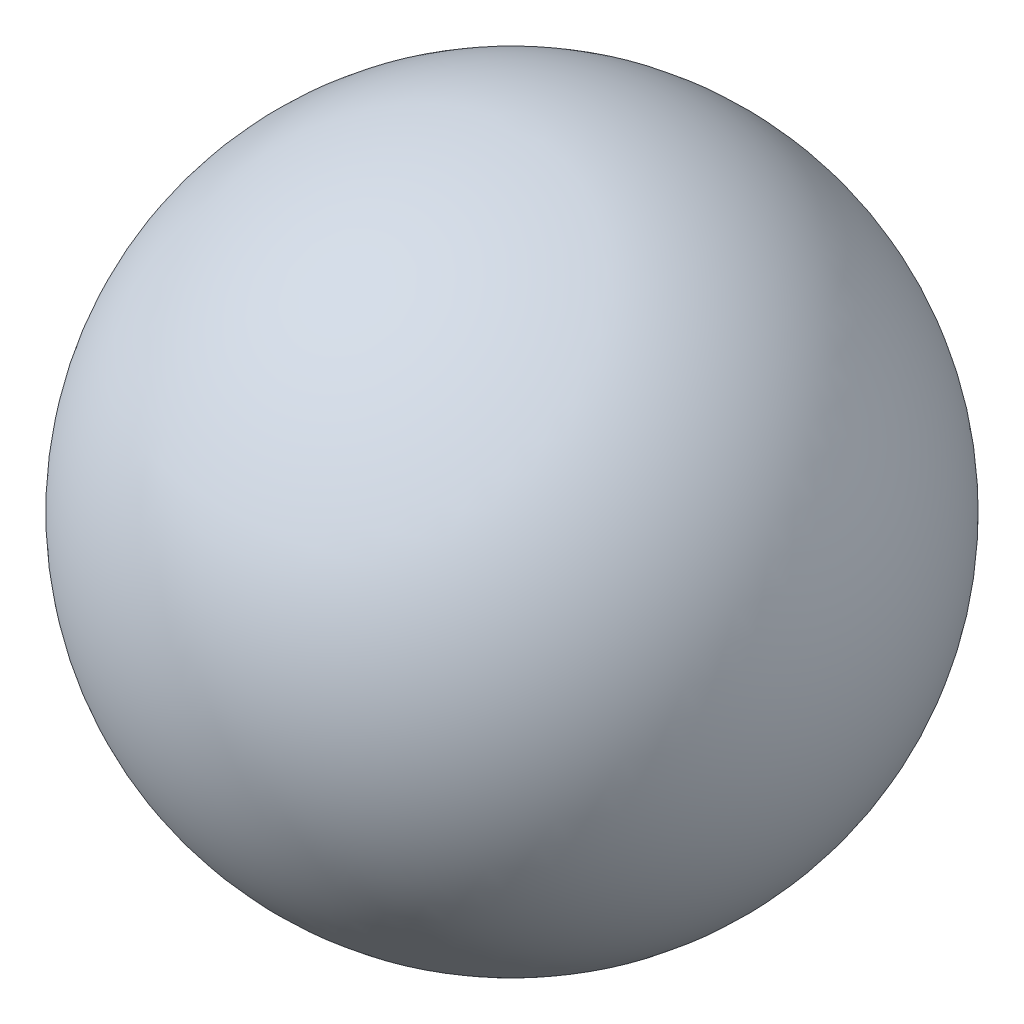
ISO-10303-21;
HEADER;
FILE_DESCRIPTION(('STEP AP214'),'2;1');
FILE_NAME('part.step','',(''),(''),'','','');
FILE_SCHEMA(('AUTOMOTIVE_DESIGN { 1 0 10303 214 1 1 1 1 }'));
ENDSEC;
DATA;
#1=APPLICATION_CONTEXT('core data for automotive mechanical design processes');
#2=APPLICATION_PROTOCOL_DEFINITION('international standard','automotive_design',2000,#1);
#3=PRODUCT_CONTEXT('',#1,'mechanical');
#4=PRODUCT('Part','Part','',(#3));
#5=PRODUCT_RELATED_PRODUCT_CATEGORY('part','',(#4));
#6=PRODUCT_DEFINITION_FORMATION('','',#4);
#7=PRODUCT_DEFINITION_CONTEXT('part definition',#1,'design');
#8=PRODUCT_DEFINITION('design','',#6,#7);
#9=PRODUCT_DEFINITION_SHAPE('','',#8);
#10=(LENGTH_UNIT() NAMED_UNIT(*) SI_UNIT(.MILLI.,.METRE.));
#11=(NAMED_UNIT(*) PLANE_ANGLE_UNIT() SI_UNIT($,.RADIAN.));
#12=(NAMED_UNIT(*) SI_UNIT($,.STERADIAN.) SOLID_ANGLE_UNIT());
#13=UNCERTAINTY_MEASURE_WITH_UNIT(LENGTH_MEASURE(1.E-05),#10,'distance_accuracy_value','');
#14=(GEOMETRIC_REPRESENTATION_CONTEXT(3) GLOBAL_UNCERTAINTY_ASSIGNED_CONTEXT((#13)) GLOBAL_UNIT_ASSIGNED_CONTEXT((#10,
#11,#12)) REPRESENTATION_CONTEXT('',''));
#15=CARTESIAN_POINT('',(0.,0.,0.));
#16=DIRECTION('',(0.,0.,1.));
#17=DIRECTION('',(1.,0.,0.));
#18=AXIS2_PLACEMENT_3D('',#15,#16,#17);
#19=CARTESIAN_POINT('',(26.5,-18.3727272727273,-50.));
#20=DIRECTION('',(0.,1.,0.));
#21=DIRECTION('',(0.,0.,1.));
#22=AXIS2_PLACEMENT_3D('',#19,#20,#21);
#23=SPHERICAL_SURFACE('',#22,85.);
#24=CARTESIAN_POINT('',(26.5000000000001,66.6272727272728,-50.));
#25=VERTEX_POINT('',#24);
#26=VERTEX_LOOP('',#25);
#27=FACE_BOUND('',#26,.T.);
#28=ADVANCED_FACE('F29',(#27),#23,.T.);
#29=CLOSED_SHELL('',(#28));
#30=MANIFOLD_SOLID_BREP('B2',#29);
#31=ADVANCED_BREP_SHAPE_REPRESENTATION('',(#18,#30),#14);
#32=SHAPE_DEFINITION_REPRESENTATION(#9,#31);
ENDSEC;
END-ISO-10303-21;
